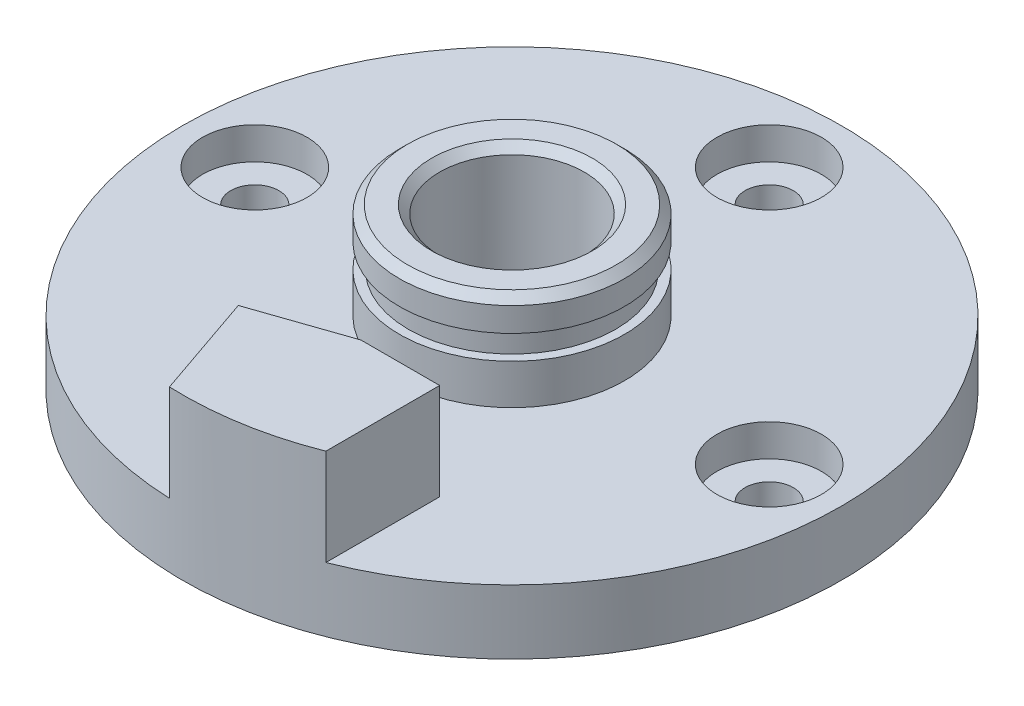
ISO-10303-21;
HEADER;
FILE_DESCRIPTION(('STEP AP214'),'2;1');
FILE_NAME('part.step','',(''),(''),'','','');
FILE_SCHEMA(('AUTOMOTIVE_DESIGN { 1 0 10303 214 1 1 1 1 }'));
ENDSEC;
DATA;
#1=APPLICATION_CONTEXT('core data for automotive mechanical design processes');
#2=APPLICATION_PROTOCOL_DEFINITION('international standard','automotive_design',2000,#1);
#3=PRODUCT_CONTEXT('',#1,'mechanical');
#4=PRODUCT('Part','Part','',(#3));
#5=PRODUCT_RELATED_PRODUCT_CATEGORY('part','',(#4));
#6=PRODUCT_DEFINITION_FORMATION('','',#4);
#7=PRODUCT_DEFINITION_CONTEXT('part definition',#1,'design');
#8=PRODUCT_DEFINITION('design','',#6,#7);
#9=PRODUCT_DEFINITION_SHAPE('','',#8);
#10=(LENGTH_UNIT() NAMED_UNIT(*) SI_UNIT(.MILLI.,.METRE.));
#11=(NAMED_UNIT(*) PLANE_ANGLE_UNIT() SI_UNIT($,.RADIAN.));
#12=(NAMED_UNIT(*) SI_UNIT($,.STERADIAN.) SOLID_ANGLE_UNIT());
#13=UNCERTAINTY_MEASURE_WITH_UNIT(LENGTH_MEASURE(1.E-05),#10,'distance_accuracy_value','');
#14=(GEOMETRIC_REPRESENTATION_CONTEXT(3) GLOBAL_UNCERTAINTY_ASSIGNED_CONTEXT((#13)) GLOBAL_UNIT_ASSIGNED_CONTEXT((#10,
#11,#12)) REPRESENTATION_CONTEXT('',''));
#15=CARTESIAN_POINT('',(0.,0.,0.));
#16=DIRECTION('',(0.,0.,1.));
#17=DIRECTION('',(1.,0.,0.));
#18=AXIS2_PLACEMENT_3D('',#15,#16,#17);
#19=CARTESIAN_POINT('',(-20.5,4.,0.));
#20=DIRECTION('',(0.,1.,0.));
#21=DIRECTION('',(-1.,0.,0.));
#22=AXIS2_PLACEMENT_3D('',#19,#20,#21);
#23=PLANE('',#22);
#24=CARTESIAN_POINT('',(-16.,4.,0.));
#25=DIRECTION('',(0.,1.,0.));
#26=DIRECTION('',(-1.,0.,0.));
#27=AXIS2_PLACEMENT_3D('',#24,#25,#26);
#28=CIRCLE('',#27,3.25);
#29=CARTESIAN_POINT('',(-19.25,4.,0.));
#30=VERTEX_POINT('',#29);
#31=EDGE_CURVE('E136',#30,#30,#28,.T.);
#32=ORIENTED_EDGE('',*,*,#31,.F.);
#33=EDGE_LOOP('',(#32));
#34=FACE_BOUND('',#33,.T.);
#35=CARTESIAN_POINT('',(0.,4.,-16.));
#36=DIRECTION('',(0.,1.,0.));
#37=DIRECTION('',(-1.,0.,0.));
#38=AXIS2_PLACEMENT_3D('',#35,#36,#37);
#39=CIRCLE('',#38,3.25);
#40=CARTESIAN_POINT('',(-3.25,4.,-16.));
#41=VERTEX_POINT('',#40);
#42=EDGE_CURVE('E142',#41,#41,#39,.T.);
#43=ORIENTED_EDGE('',*,*,#42,.F.);
#44=EDGE_LOOP('',(#43));
#45=FACE_BOUND('',#44,.T.);
#46=CARTESIAN_POINT('',(16.,3.99999999999999,0.));
#47=DIRECTION('',(0.,1.,0.));
#48=DIRECTION('',(-1.,0.,0.));
#49=AXIS2_PLACEMENT_3D('',#46,#47,#48);
#50=CIRCLE('',#49,3.25);
#51=CARTESIAN_POINT('',(12.75,3.99999999999999,0.));
#52=VERTEX_POINT('',#51);
#53=EDGE_CURVE('E131',#52,#52,#50,.T.);
#54=ORIENTED_EDGE('',*,*,#53,.F.);
#55=EDGE_LOOP('',(#54));
#56=FACE_BOUND('',#55,.T.);
#57=CARTESIAN_POINT('',(0.,4.,0.));
#58=DIRECTION('',(0.,1.,0.));
#59=DIRECTION('',(-1.,0.,0.));
#60=AXIS2_PLACEMENT_3D('',#57,#58,#59);
#61=CIRCLE('',#60,7.);
#62=CARTESIAN_POINT('',(-7.,4.,0.));
#63=VERTEX_POINT('',#62);
#64=EDGE_CURVE('E172',#63,#63,#61,.T.);
#65=ORIENTED_EDGE('',*,*,#64,.F.);
#66=EDGE_LOOP('',(#65));
#67=FACE_BOUND('',#66,.T.);
#68=DIRECTION('',(0.325568154457158,0.,0.945518575599316));
#69=VECTOR('',#68,1.);
#70=CARTESIAN_POINT('',(-3.07311145359589,4.,13.9534089267429));
#71=LINE('',#70,#69);
#72=CARTESIAN_POINT('',(-3.07311145359589,4.,13.9534089267429));
#73=VERTEX_POINT('',#72);
#74=CARTESIAN_POINT('',(-0.82465292644425,4.,20.4834066392997));
#75=VERTEX_POINT('',#74);
#76=EDGE_CURVE('E102',#73,#75,#71,.T.);
#77=ORIENTED_EDGE('',*,*,#76,.F.);
#78=DIRECTION('',(-0.945518575599317,0.,0.325568154457158));
#79=VECTOR('',#78,1.);
#80=CARTESIAN_POINT('',(2.6,4.,12.));
#81=LINE('',#80,#79);
#82=CARTESIAN_POINT('',(2.6,4.,12.));
#83=VERTEX_POINT('',#82);
#84=EDGE_CURVE('E105',#83,#73,#81,.T.);
#85=ORIENTED_EDGE('',*,*,#84,.F.);
#86=DIRECTION('',(-1.,0.,0.));
#87=VECTOR('',#86,1.);
#88=CARTESIAN_POINT('',(7.5,4.,12.));
#89=LINE('',#88,#87);
#90=CARTESIAN_POINT('',(7.5,4.,12.));
#91=VERTEX_POINT('',#90);
#92=EDGE_CURVE('E49',#91,#83,#89,.T.);
#93=ORIENTED_EDGE('',*,*,#92,.F.);
#94=DIRECTION('',(0.,0.,-1.));
#95=VECTOR('',#94,1.);
#96=CARTESIAN_POINT('',(7.5,4.,12.));
#97=LINE('',#96,#95);
#98=CARTESIAN_POINT('',(7.49999999999999,4.,19.0787840283389));
#99=VERTEX_POINT('',#98);
#100=EDGE_CURVE('E116',#99,#91,#97,.T.);
#101=ORIENTED_EDGE('',*,*,#100,.F.);
#102=CARTESIAN_POINT('',(0.,4.,0.));
#103=DIRECTION('',(0.,1.,0.));
#104=DIRECTION('',(-1.,0.,0.));
#105=AXIS2_PLACEMENT_3D('',#102,#103,#104);
#106=CIRCLE('',#105,20.5);
#107=EDGE_CURVE('E69',#99,#75,#106,.T.);
#108=ORIENTED_EDGE('',*,*,#107,.T.);
#109=EDGE_LOOP('',(#77,#85,#93,#101,#108));
#110=FACE_BOUND('',#109,.T.);
#111=ADVANCED_FACE('F34',(#34,#45,#56,#67,#110),#23,.T.);
#112=CARTESIAN_POINT('',(0.,7.,0.));
#113=DIRECTION('',(0.,1.,0.));
#114=DIRECTION('',(-1.,0.,0.));
#115=AXIS2_PLACEMENT_3D('',#112,#113,#114);
#116=CYLINDRICAL_SURFACE('',#115,20.5);
#117=CARTESIAN_POINT('',(0.,0.,0.));
#118=DIRECTION('',(0.,1.,0.));
#119=DIRECTION('',(-1.,0.,0.));
#120=AXIS2_PLACEMENT_3D('',#117,#118,#119);
#121=CIRCLE('',#120,20.5);
#122=CARTESIAN_POINT('',(-20.5,0.,0.));
#123=VERTEX_POINT('',#122);
#124=EDGE_CURVE('E176',#123,#123,#121,.T.);
#125=ORIENTED_EDGE('',*,*,#124,.T.);
#126=EDGE_LOOP('',(#125));
#127=FACE_BOUND('',#126,.T.);
#128=CARTESIAN_POINT('',(0.,10.,0.));
#129=DIRECTION('',(0.,1.,0.));
#130=DIRECTION('',(1.,0.,0.));
#131=AXIS2_PLACEMENT_3D('',#128,#129,#130);
#132=CIRCLE('',#131,20.5);
#133=CARTESIAN_POINT('',(-0.824652926444249,10.,20.4834066392997));
#134=VERTEX_POINT('',#133);
#135=CARTESIAN_POINT('',(7.49999999999999,9.99999999999999,19.0787840283389));
#136=VERTEX_POINT('',#135);
#137=EDGE_CURVE('E58',#134,#136,#132,.T.);
#138=ORIENTED_EDGE('',*,*,#137,.F.);
#139=DIRECTION('',(0.,-1.,0.));
#140=VECTOR('',#139,1.);
#141=CARTESIAN_POINT('',(-0.824652926444249,10.,20.4834066392997));
#142=LINE('',#141,#140);
#143=EDGE_CURVE('E97',#134,#75,#142,.T.);
#144=ORIENTED_EDGE('',*,*,#143,.T.);
#145=ORIENTED_EDGE('',*,*,#107,.F.);
#146=DIRECTION('',(0.,-1.,0.));
#147=VECTOR('',#146,1.);
#148=CARTESIAN_POINT('',(7.49999999999999,9.99999999999999,19.0787840283389));
#149=LINE('',#148,#147);
#150=EDGE_CURVE('E123',#136,#99,#149,.T.);
#151=ORIENTED_EDGE('',*,*,#150,.F.);
#152=EDGE_LOOP('',(#138,#144,#145,#151));
#153=FACE_BOUND('',#152,.T.);
#154=ADVANCED_FACE('F215',(#127,#153),#116,.T.);
#155=CARTESIAN_POINT('',(7.5,9.99999999999999,12.));
#156=DIRECTION('',(0.,0.,1.));
#157=DIRECTION('',(1.,0.,0.));
#158=AXIS2_PLACEMENT_3D('',#155,#156,#157);
#159=PLANE('',#158);
#160=DIRECTION('',(0.,1.,0.));
#161=VECTOR('',#160,1.);
#162=CARTESIAN_POINT('',(2.6,4.,12.));
#163=LINE('',#162,#161);
#164=CARTESIAN_POINT('',(2.60000000000001,10.,12.));
#165=VERTEX_POINT('',#164);
#166=EDGE_CURVE('E90',#83,#165,#163,.T.);
#167=ORIENTED_EDGE('',*,*,#166,.T.);
#168=DIRECTION('',(-1.,0.,0.));
#169=VECTOR('',#168,1.);
#170=CARTESIAN_POINT('',(7.5,9.99999999999999,12.));
#171=LINE('',#170,#169);
#172=CARTESIAN_POINT('',(7.5,9.99999999999999,12.));
#173=VERTEX_POINT('',#172);
#174=EDGE_CURVE('E101',#173,#165,#171,.T.);
#175=ORIENTED_EDGE('',*,*,#174,.F.);
#176=DIRECTION('',(0.,-1.,0.));
#177=VECTOR('',#176,1.);
#178=CARTESIAN_POINT('',(7.5,9.99999999999999,12.));
#179=LINE('',#178,#177);
#180=EDGE_CURVE('E129',#173,#91,#179,.T.);
#181=ORIENTED_EDGE('',*,*,#180,.T.);
#182=ORIENTED_EDGE('',*,*,#92,.T.);
#183=EDGE_LOOP('',(#167,#175,#181,#182));
#184=FACE_BOUND('',#183,.T.);
#185=ADVANCED_FACE('F221',(#184),#159,.F.);
#186=CARTESIAN_POINT('',(0.,10.,0.));
#187=DIRECTION('',(0.,-1.,0.));
#188=DIRECTION('',(1.,0.,0.));
#189=AXIS2_PLACEMENT_3D('',#186,#187,#188);
#190=PLANE('',#189);
#191=ORIENTED_EDGE('',*,*,#174,.T.);
#192=DIRECTION('',(-0.945518575599317,0.,0.325568154457158));
#193=VECTOR('',#192,1.);
#194=CARTESIAN_POINT('',(2.60000000000001,10.,12.));
#195=LINE('',#194,#193);
#196=CARTESIAN_POINT('',(-3.07311145359589,10.,13.9534089267429));
#197=VERTEX_POINT('',#196);
#198=EDGE_CURVE('E77',#165,#197,#195,.T.);
#199=ORIENTED_EDGE('',*,*,#198,.T.);
#200=DIRECTION('',(0.325568154457158,0.,0.945518575599316));
#201=VECTOR('',#200,1.);
#202=CARTESIAN_POINT('',(-3.07311145359589,10.,13.9534089267429));
#203=LINE('',#202,#201);
#204=EDGE_CURVE('E94',#197,#134,#203,.T.);
#205=ORIENTED_EDGE('',*,*,#204,.T.);
#206=ORIENTED_EDGE('',*,*,#137,.T.);
#207=DIRECTION('',(0.,0.,-1.));
#208=VECTOR('',#207,1.);
#209=CARTESIAN_POINT('',(7.5,9.99999999999999,12.));
#210=LINE('',#209,#208);
#211=EDGE_CURVE('E119',#136,#173,#210,.T.);
#212=ORIENTED_EDGE('',*,*,#211,.T.);
#213=EDGE_LOOP('',(#191,#199,#205,#206,#212));
#214=FACE_BOUND('',#213,.T.);
#215=ADVANCED_FACE('F100',(#214),#190,.F.);
#216=CARTESIAN_POINT('',(0.,7.,0.));
#217=DIRECTION('',(0.,1.,0.));
#218=DIRECTION('',(-1.,0.,0.));
#219=AXIS2_PLACEMENT_3D('',#216,#217,#218);
#220=CYLINDRICAL_SURFACE('',#219,4.5);
#221=CARTESIAN_POINT('',(0.,9.49999999999999,0.));
#222=DIRECTION('',(0.,1.,0.));
#223=DIRECTION('',(-1.,0.,0.));
#224=AXIS2_PLACEMENT_3D('',#221,#222,#223);
#225=CIRCLE('',#224,4.5);
#226=CARTESIAN_POINT('',(-4.5,9.49999999999999,0.));
#227=VERTEX_POINT('',#226);
#228=EDGE_CURVE('E189',#227,#227,#225,.T.);
#229=ORIENTED_EDGE('',*,*,#228,.T.);
#230=EDGE_LOOP('',(#229));
#231=FACE_BOUND('',#230,.T.);
#232=CARTESIAN_POINT('',(0.,1.50000000000001,0.));
#233=DIRECTION('',(0.,-1.,0.));
#234=DIRECTION('',(1.,0.,0.));
#235=AXIS2_PLACEMENT_3D('',#232,#233,#234);
#236=CIRCLE('',#235,4.5);
#237=CARTESIAN_POINT('',(4.5,1.50000000000001,0.));
#238=VERTEX_POINT('',#237);
#239=EDGE_CURVE('E179',#238,#238,#236,.T.);
#240=ORIENTED_EDGE('',*,*,#239,.T.);
#241=EDGE_LOOP('',(#240));
#242=FACE_BOUND('',#241,.T.);
#243=ADVANCED_FACE('F235',(#231,#242),#220,.F.);
#244=CARTESIAN_POINT('',(16.,10.,0.));
#245=DIRECTION('',(0.,-1.,0.));
#246=DIRECTION('',(0.,0.,-1.));
#247=AXIS2_PLACEMENT_3D('',#244,#245,#246);
#248=CYLINDRICAL_SURFACE('',#247,1.5);
#249=CARTESIAN_POINT('',(16.,0.,0.));
#250=DIRECTION('',(0.,1.,0.));
#251=DIRECTION('',(0.,0.,1.));
#252=AXIS2_PLACEMENT_3D('',#249,#250,#251);
#253=CIRCLE('',#252,1.5);
#254=CARTESIAN_POINT('',(16.,0.,1.5));
#255=VERTEX_POINT('',#254);
#256=EDGE_CURVE('E157',#255,#255,#253,.T.);
#257=ORIENTED_EDGE('',*,*,#256,.F.);
#258=EDGE_LOOP('',(#257));
#259=FACE_BOUND('',#258,.T.);
#260=CARTESIAN_POINT('',(16.,1.99999999999999,0.));
#261=DIRECTION('',(0.,1.,0.));
#262=DIRECTION('',(-1.,0.,0.));
#263=AXIS2_PLACEMENT_3D('',#260,#261,#262);
#264=CIRCLE('',#263,1.5);
#265=CARTESIAN_POINT('',(14.5,1.99999999999999,0.));
#266=VERTEX_POINT('',#265);
#267=EDGE_CURVE('E160',#266,#266,#264,.T.);
#268=ORIENTED_EDGE('',*,*,#267,.T.);
#269=EDGE_LOOP('',(#268));
#270=FACE_BOUND('',#269,.T.);
#271=ADVANCED_FACE('F238',(#259,#270),#248,.F.);
#272=CARTESIAN_POINT('',(0.,10.,-16.));
#273=DIRECTION('',(0.,-1.,0.));
#274=DIRECTION('',(0.,0.,-1.));
#275=AXIS2_PLACEMENT_3D('',#272,#273,#274);
#276=CYLINDRICAL_SURFACE('',#275,1.5);
#277=CARTESIAN_POINT('',(0.,0.,-16.));
#278=DIRECTION('',(0.,1.,0.));
#279=DIRECTION('',(0.,0.,1.));
#280=AXIS2_PLACEMENT_3D('',#277,#278,#279);
#281=CIRCLE('',#280,1.5);
#282=CARTESIAN_POINT('',(0.,0.,-14.5));
#283=VERTEX_POINT('',#282);
#284=EDGE_CURVE('E154',#283,#283,#281,.T.);
#285=ORIENTED_EDGE('',*,*,#284,.F.);
#286=EDGE_LOOP('',(#285));
#287=FACE_BOUND('',#286,.T.);
#288=CARTESIAN_POINT('',(0.,2.,-16.));
#289=DIRECTION('',(0.,1.,0.));
#290=DIRECTION('',(-1.,0.,0.));
#291=AXIS2_PLACEMENT_3D('',#288,#289,#290);
#292=CIRCLE('',#291,1.5);
#293=CARTESIAN_POINT('',(-1.5,2.,-16.));
#294=VERTEX_POINT('',#293);
#295=EDGE_CURVE('E182',#294,#294,#292,.T.);
#296=ORIENTED_EDGE('',*,*,#295,.T.);
#297=EDGE_LOOP('',(#296));
#298=FACE_BOUND('',#297,.T.);
#299=ADVANCED_FACE('F334',(#287,#298),#276,.F.);
#300=CARTESIAN_POINT('',(-16.,10.,0.));
#301=DIRECTION('',(0.,-1.,0.));
#302=DIRECTION('',(0.,0.,-1.));
#303=AXIS2_PLACEMENT_3D('',#300,#301,#302);
#304=CYLINDRICAL_SURFACE('',#303,1.5);
#305=CARTESIAN_POINT('',(-16.,0.,0.));
#306=DIRECTION('',(0.,1.,0.));
#307=DIRECTION('',(0.,0.,1.));
#308=AXIS2_PLACEMENT_3D('',#305,#306,#307);
#309=CIRCLE('',#308,1.5);
#310=CARTESIAN_POINT('',(-16.,0.,1.5));
#311=VERTEX_POINT('',#310);
#312=EDGE_CURVE('E150',#311,#311,#309,.T.);
#313=ORIENTED_EDGE('',*,*,#312,.F.);
#314=EDGE_LOOP('',(#313));
#315=FACE_BOUND('',#314,.T.);
#316=CARTESIAN_POINT('',(-16.,2.,0.));
#317=DIRECTION('',(0.,1.,0.));
#318=DIRECTION('',(-1.,0.,0.));
#319=AXIS2_PLACEMENT_3D('',#316,#317,#318);
#320=CIRCLE('',#319,1.5);
#321=CARTESIAN_POINT('',(-17.5,2.,0.));
#322=VERTEX_POINT('',#321);
#323=EDGE_CURVE('E135',#322,#322,#320,.T.);
#324=ORIENTED_EDGE('',*,*,#323,.T.);
#325=EDGE_LOOP('',(#324));
#326=FACE_BOUND('',#325,.T.);
#327=ADVANCED_FACE('F233',(#315,#326),#304,.F.);
#328=CARTESIAN_POINT('',(-4.5,0.,0.));
#329=DIRECTION('',(0.,-1.,0.));
#330=DIRECTION('',(1.,0.,0.));
#331=AXIS2_PLACEMENT_3D('',#328,#329,#330);
#332=PLANE('',#331);
#333=CARTESIAN_POINT('',(0.,0.,0.));
#334=DIRECTION('',(0.,-1.,0.));
#335=DIRECTION('',(1.,0.,0.));
#336=AXIS2_PLACEMENT_3D('',#333,#334,#335);
#337=CIRCLE('',#336,7.5);
#338=CARTESIAN_POINT('',(7.5,0.,0.));
#339=VERTEX_POINT('',#338);
#340=EDGE_CURVE('E108',#339,#339,#337,.T.);
#341=ORIENTED_EDGE('',*,*,#340,.F.);
#342=EDGE_LOOP('',(#341));
#343=FACE_BOUND('',#342,.T.);
#344=ORIENTED_EDGE('',*,*,#312,.T.);
#345=EDGE_LOOP('',(#344));
#346=FACE_BOUND('',#345,.T.);
#347=ORIENTED_EDGE('',*,*,#284,.T.);
#348=EDGE_LOOP('',(#347));
#349=FACE_BOUND('',#348,.T.);
#350=ORIENTED_EDGE('',*,*,#256,.T.);
#351=EDGE_LOOP('',(#350));
#352=FACE_BOUND('',#351,.T.);
#353=ORIENTED_EDGE('',*,*,#124,.F.);
#354=EDGE_LOOP('',(#353));
#355=FACE_BOUND('',#354,.T.);
#356=ADVANCED_FACE('F230',(#343,#346,#349,#352,#355),#332,.T.);
#357=CARTESIAN_POINT('',(0.,7.,0.));
#358=DIRECTION('',(0.,1.,0.));
#359=DIRECTION('',(-1.,0.,0.));
#360=AXIS2_PLACEMENT_3D('',#357,#358,#359);
#361=CYLINDRICAL_SURFACE('',#360,7.);
#362=ORIENTED_EDGE('',*,*,#64,.T.);
#363=EDGE_LOOP('',(#362));
#364=FACE_BOUND('',#363,.T.);
#365=CARTESIAN_POINT('',(0.,6.5,0.));
#366=DIRECTION('',(0.,1.,0.));
#367=DIRECTION('',(-1.,0.,0.));
#368=AXIS2_PLACEMENT_3D('',#365,#366,#367);
#369=CIRCLE('',#368,7.);
#370=CARTESIAN_POINT('',(-7.,6.5,0.));
#371=VERTEX_POINT('',#370);
#372=EDGE_CURVE('E169',#371,#371,#369,.T.);
#373=ORIENTED_EDGE('',*,*,#372,.F.);
#374=EDGE_LOOP('',(#373));
#375=FACE_BOUND('',#374,.T.);
#376=ADVANCED_FACE('F227',(#364,#375),#361,.T.);
#377=CARTESIAN_POINT('',(-7.,6.5,0.));
#378=DIRECTION('',(0.,1.,0.));
#379=DIRECTION('',(-1.,0.,0.));
#380=AXIS2_PLACEMENT_3D('',#377,#378,#379);
#381=PLANE('',#380);
#382=ORIENTED_EDGE('',*,*,#372,.T.);
#383=EDGE_LOOP('',(#382));
#384=FACE_BOUND('',#383,.T.);
#385=CARTESIAN_POINT('',(0.,6.5,0.));
#386=DIRECTION('',(0.,1.,0.));
#387=DIRECTION('',(-1.,0.,0.));
#388=AXIS2_PLACEMENT_3D('',#385,#386,#387);
#389=CIRCLE('',#388,6.45);
#390=CARTESIAN_POINT('',(-6.45,6.5,0.));
#391=VERTEX_POINT('',#390);
#392=EDGE_CURVE('E166',#391,#391,#389,.T.);
#393=ORIENTED_EDGE('',*,*,#392,.F.);
#394=EDGE_LOOP('',(#393));
#395=FACE_BOUND('',#394,.T.);
#396=ADVANCED_FACE('F277',(#384,#395),#381,.T.);
#397=CARTESIAN_POINT('',(0.,7.,0.));
#398=DIRECTION('',(0.,1.,0.));
#399=DIRECTION('',(-1.,0.,0.));
#400=AXIS2_PLACEMENT_3D('',#397,#398,#399);
#401=CYLINDRICAL_SURFACE('',#400,6.45);
#402=ORIENTED_EDGE('',*,*,#392,.T.);
#403=EDGE_LOOP('',(#402));
#404=FACE_BOUND('',#403,.T.);
#405=CARTESIAN_POINT('',(0.,8.,0.));
#406=DIRECTION('',(0.,1.,0.));
#407=DIRECTION('',(-1.,0.,0.));
#408=AXIS2_PLACEMENT_3D('',#405,#406,#407);
#409=CIRCLE('',#408,6.45);
#410=CARTESIAN_POINT('',(-6.45,8.,0.));
#411=VERTEX_POINT('',#410);
#412=EDGE_CURVE('E163',#411,#411,#409,.T.);
#413=ORIENTED_EDGE('',*,*,#412,.F.);
#414=EDGE_LOOP('',(#413));
#415=FACE_BOUND('',#414,.T.);
#416=ADVANCED_FACE('F274',(#404,#415),#401,.T.);
#417=CARTESIAN_POINT('',(-6.45,8.,0.));
#418=DIRECTION('',(0.,-1.,0.));
#419=DIRECTION('',(1.,0.,0.));
#420=AXIS2_PLACEMENT_3D('',#417,#418,#419);
#421=PLANE('',#420);
#422=ORIENTED_EDGE('',*,*,#412,.T.);
#423=EDGE_LOOP('',(#422));
#424=FACE_BOUND('',#423,.T.);
#425=CARTESIAN_POINT('',(0.,8.,0.));
#426=DIRECTION('',(0.,1.,0.));
#427=DIRECTION('',(-1.,0.,0.));
#428=AXIS2_PLACEMENT_3D('',#425,#426,#427);
#429=CIRCLE('',#428,7.);
#430=CARTESIAN_POINT('',(-7.,8.,0.));
#431=VERTEX_POINT('',#430);
#432=EDGE_CURVE('E153',#431,#431,#429,.T.);
#433=ORIENTED_EDGE('',*,*,#432,.F.);
#434=EDGE_LOOP('',(#433));
#435=FACE_BOUND('',#434,.T.);
#436=ADVANCED_FACE('F266',(#424,#435),#421,.T.);
#437=CARTESIAN_POINT('',(0.,7.,0.));
#438=DIRECTION('',(0.,1.,0.));
#439=DIRECTION('',(-1.,0.,0.));
#440=AXIS2_PLACEMENT_3D('',#437,#438,#439);
#441=CYLINDRICAL_SURFACE('',#440,7.);
#442=CARTESIAN_POINT('',(0.,9.5,0.));
#443=DIRECTION('',(0.,1.,0.));
#444=DIRECTION('',(-1.,0.,0.));
#445=AXIS2_PLACEMENT_3D('',#442,#443,#444);
#446=CIRCLE('',#445,7.);
#447=CARTESIAN_POINT('',(-7.,9.5,0.));
#448=VERTEX_POINT('',#447);
#449=EDGE_CURVE('E11',#448,#448,#446,.F.);
#450=ORIENTED_EDGE('',*,*,#449,.T.);
#451=EDGE_LOOP('',(#450));
#452=FACE_BOUND('',#451,.T.);
#453=ORIENTED_EDGE('',*,*,#432,.T.);
#454=EDGE_LOOP('',(#453));
#455=FACE_BOUND('',#454,.T.);
#456=ADVANCED_FACE('F257',(#452,#455),#441,.T.);
#457=CARTESIAN_POINT('',(-7.,10.,0.));
#458=DIRECTION('',(0.,1.,0.));
#459=DIRECTION('',(-1.,0.,0.));
#460=AXIS2_PLACEMENT_3D('',#457,#458,#459);
#461=PLANE('',#460);
#462=CARTESIAN_POINT('',(0.,10.,0.));
#463=DIRECTION('',(0.,1.,0.));
#464=DIRECTION('',(-1.,0.,0.));
#465=AXIS2_PLACEMENT_3D('',#462,#463,#464);
#466=CIRCLE('',#465,6.50000000000001);
#467=CARTESIAN_POINT('',(-6.50000000000001,10.,0.));
#468=VERTEX_POINT('',#467);
#469=EDGE_CURVE('E42',#468,#468,#466,.T.);
#470=ORIENTED_EDGE('',*,*,#469,.T.);
#471=EDGE_LOOP('',(#470));
#472=FACE_BOUND('',#471,.T.);
#473=CARTESIAN_POINT('',(0.,10.,0.));
#474=DIRECTION('',(0.,1.,0.));
#475=DIRECTION('',(-1.,0.,0.));
#476=AXIS2_PLACEMENT_3D('',#473,#474,#475);
#477=CIRCLE('',#476,5.00000000000001);
#478=CARTESIAN_POINT('',(-5.00000000000001,10.,0.));
#479=VERTEX_POINT('',#478);
#480=EDGE_CURVE('E192',#479,#479,#477,.F.);
#481=ORIENTED_EDGE('',*,*,#480,.T.);
#482=EDGE_LOOP('',(#481));
#483=FACE_BOUND('',#482,.T.);
#484=ADVANCED_FACE('F200',(#472,#483),#461,.T.);
#485=CARTESIAN_POINT('',(-16.,2.,0.));
#486=DIRECTION('',(0.,1.,0.));
#487=DIRECTION('',(0.,0.,1.));
#488=AXIS2_PLACEMENT_3D('',#485,#486,#487);
#489=CYLINDRICAL_SURFACE('',#488,3.25);
#490=CARTESIAN_POINT('',(-16.,2.,0.));
#491=DIRECTION('',(0.,1.,0.));
#492=DIRECTION('',(-1.,0.,0.));
#493=AXIS2_PLACEMENT_3D('',#490,#491,#492);
#494=CIRCLE('',#493,3.25);
#495=CARTESIAN_POINT('',(-19.25,2.,0.));
#496=VERTEX_POINT('',#495);
#497=EDGE_CURVE('E132',#496,#496,#494,.T.);
#498=ORIENTED_EDGE('',*,*,#497,.F.);
#499=EDGE_LOOP('',(#498));
#500=FACE_BOUND('',#499,.T.);
#501=ORIENTED_EDGE('',*,*,#31,.T.);
#502=EDGE_LOOP('',(#501));
#503=FACE_BOUND('',#502,.T.);
#504=ADVANCED_FACE('F256',(#500,#503),#489,.F.);
#505=CARTESIAN_POINT('',(-16.,2.,0.));
#506=DIRECTION('',(0.,1.,0.));
#507=DIRECTION('',(-1.,0.,0.));
#508=AXIS2_PLACEMENT_3D('',#505,#506,#507);
#509=PLANE('',#508);
#510=ORIENTED_EDGE('',*,*,#323,.F.);
#511=EDGE_LOOP('',(#510));
#512=FACE_BOUND('',#511,.T.);
#513=ORIENTED_EDGE('',*,*,#497,.T.);
#514=EDGE_LOOP('',(#513));
#515=FACE_BOUND('',#514,.T.);
#516=ADVANCED_FACE('F263',(#512,#515),#509,.T.);
#517=CARTESIAN_POINT('',(0.,2.,-16.));
#518=DIRECTION('',(0.,1.,0.));
#519=DIRECTION('',(0.,0.,1.));
#520=AXIS2_PLACEMENT_3D('',#517,#518,#519);
#521=CYLINDRICAL_SURFACE('',#520,3.25);
#522=CARTESIAN_POINT('',(0.,2.,-16.));
#523=DIRECTION('',(0.,1.,0.));
#524=DIRECTION('',(-1.,0.,0.));
#525=AXIS2_PLACEMENT_3D('',#522,#523,#524);
#526=CIRCLE('',#525,3.25);
#527=CARTESIAN_POINT('',(-3.25,2.,-16.));
#528=VERTEX_POINT('',#527);
#529=EDGE_CURVE('E139',#528,#528,#526,.T.);
#530=ORIENTED_EDGE('',*,*,#529,.F.);
#531=EDGE_LOOP('',(#530));
#532=FACE_BOUND('',#531,.T.);
#533=ORIENTED_EDGE('',*,*,#42,.T.);
#534=EDGE_LOOP('',(#533));
#535=FACE_BOUND('',#534,.T.);
#536=ADVANCED_FACE('F316',(#532,#535),#521,.F.);
#537=CARTESIAN_POINT('',(0.,2.,-16.));
#538=DIRECTION('',(0.,1.,0.));
#539=DIRECTION('',(-1.,0.,0.));
#540=AXIS2_PLACEMENT_3D('',#537,#538,#539);
#541=PLANE('',#540);
#542=ORIENTED_EDGE('',*,*,#295,.F.);
#543=EDGE_LOOP('',(#542));
#544=FACE_BOUND('',#543,.T.);
#545=ORIENTED_EDGE('',*,*,#529,.T.);
#546=EDGE_LOOP('',(#545));
#547=FACE_BOUND('',#546,.T.);
#548=ADVANCED_FACE('F319',(#544,#547),#541,.T.);
#549=CARTESIAN_POINT('',(16.,1.99999999999999,0.));
#550=DIRECTION('',(0.,1.,0.));
#551=DIRECTION('',(0.,0.,1.));
#552=AXIS2_PLACEMENT_3D('',#549,#550,#551);
#553=CYLINDRICAL_SURFACE('',#552,3.25);
#554=CARTESIAN_POINT('',(16.,1.99999999999999,0.));
#555=DIRECTION('',(0.,1.,0.));
#556=DIRECTION('',(-1.,0.,0.));
#557=AXIS2_PLACEMENT_3D('',#554,#555,#556);
#558=CIRCLE('',#557,3.25);
#559=CARTESIAN_POINT('',(12.75,2.,0.));
#560=VERTEX_POINT('',#559);
#561=EDGE_CURVE('E145',#560,#560,#558,.T.);
#562=ORIENTED_EDGE('',*,*,#561,.F.);
#563=EDGE_LOOP('',(#562));
#564=FACE_BOUND('',#563,.T.);
#565=ORIENTED_EDGE('',*,*,#53,.T.);
#566=EDGE_LOOP('',(#565));
#567=FACE_BOUND('',#566,.T.);
#568=ADVANCED_FACE('F322',(#564,#567),#553,.F.);
#569=CARTESIAN_POINT('',(16.,1.99999999999999,0.));
#570=DIRECTION('',(0.,1.,0.));
#571=DIRECTION('',(-1.,0.,0.));
#572=AXIS2_PLACEMENT_3D('',#569,#570,#571);
#573=PLANE('',#572);
#574=ORIENTED_EDGE('',*,*,#267,.F.);
#575=EDGE_LOOP('',(#574));
#576=FACE_BOUND('',#575,.T.);
#577=ORIENTED_EDGE('',*,*,#561,.T.);
#578=EDGE_LOOP('',(#577));
#579=FACE_BOUND('',#578,.T.);
#580=ADVANCED_FACE('F314',(#576,#579),#573,.T.);
#581=CARTESIAN_POINT('',(7.5,9.99999999999999,12.));
#582=DIRECTION('',(-1.,0.,0.));
#583=DIRECTION('',(0.,0.,1.));
#584=AXIS2_PLACEMENT_3D('',#581,#582,#583);
#585=PLANE('',#584);
#586=ORIENTED_EDGE('',*,*,#100,.T.);
#587=ORIENTED_EDGE('',*,*,#180,.F.);
#588=ORIENTED_EDGE('',*,*,#211,.F.);
#589=ORIENTED_EDGE('',*,*,#150,.T.);
#590=EDGE_LOOP('',(#586,#587,#588,#589));
#591=FACE_BOUND('',#590,.T.);
#592=ADVANCED_FACE('F302',(#591),#585,.F.);
#593=CARTESIAN_POINT('',(0.,1.,0.));
#594=DIRECTION('',(0.,-1.,0.));
#595=DIRECTION('',(1.,0.,0.));
#596=AXIS2_PLACEMENT_3D('',#593,#594,#595);
#597=CYLINDRICAL_SURFACE('',#596,7.5);
#598=CARTESIAN_POINT('',(0.,1.,0.));
#599=DIRECTION('',(0.,-1.,0.));
#600=DIRECTION('',(1.,0.,0.));
#601=AXIS2_PLACEMENT_3D('',#598,#599,#600);
#602=CIRCLE('',#601,7.5);
#603=CARTESIAN_POINT('',(7.5,0.999999999999999,0.));
#604=VERTEX_POINT('',#603);
#605=EDGE_CURVE('E113',#604,#604,#602,.T.);
#606=ORIENTED_EDGE('',*,*,#605,.F.);
#607=EDGE_LOOP('',(#606));
#608=FACE_BOUND('',#607,.T.);
#609=ORIENTED_EDGE('',*,*,#340,.T.);
#610=EDGE_LOOP('',(#609));
#611=FACE_BOUND('',#610,.T.);
#612=ADVANCED_FACE('F246',(#608,#611),#597,.F.);
#613=CARTESIAN_POINT('',(0.,1.,0.));
#614=DIRECTION('',(0.,-1.,0.));
#615=DIRECTION('',(1.,0.,0.));
#616=AXIS2_PLACEMENT_3D('',#613,#614,#615);
#617=PLANE('',#616);
#618=CARTESIAN_POINT('',(0.,1.,0.));
#619=DIRECTION('',(0.,-1.,0.));
#620=DIRECTION('',(1.,0.,0.));
#621=AXIS2_PLACEMENT_3D('',#618,#619,#620);
#622=CIRCLE('',#621,5.00000000000002);
#623=CARTESIAN_POINT('',(5.00000000000002,0.999999999999999,0.));
#624=VERTEX_POINT('',#623);
#625=EDGE_CURVE('E195',#624,#624,#622,.F.);
#626=ORIENTED_EDGE('',*,*,#625,.T.);
#627=EDGE_LOOP('',(#626));
#628=FACE_BOUND('',#627,.T.);
#629=ORIENTED_EDGE('',*,*,#605,.T.);
#630=EDGE_LOOP('',(#629));
#631=FACE_BOUND('',#630,.T.);
#632=ADVANCED_FACE('F241',(#628,#631),#617,.T.);
#633=CARTESIAN_POINT('',(0.,9.49999999999999,0.));
#634=DIRECTION('',(0.,1.,0.));
#635=DIRECTION('',(-1.,0.,0.));
#636=AXIS2_PLACEMENT_3D('',#633,#634,#635);
#637=CONICAL_SURFACE('',#636,4.5,0.785398163397454);
#638=ORIENTED_EDGE('',*,*,#480,.F.);
#639=EDGE_LOOP('',(#638));
#640=FACE_BOUND('',#639,.T.);
#641=ORIENTED_EDGE('',*,*,#228,.F.);
#642=EDGE_LOOP('',(#641));
#643=FACE_BOUND('',#642,.T.);
#644=ADVANCED_FACE('F211',(#640,#643),#637,.F.);
#645=CARTESIAN_POINT('',(0.,1.50000000000001,0.));
#646=DIRECTION('',(0.,-1.,0.));
#647=DIRECTION('',(1.,0.,0.));
#648=AXIS2_PLACEMENT_3D('',#645,#646,#647);
#649=CONICAL_SURFACE('',#648,4.5,0.785398163397453);
#650=ORIENTED_EDGE('',*,*,#625,.F.);
#651=EDGE_LOOP('',(#650));
#652=FACE_BOUND('',#651,.T.);
#653=ORIENTED_EDGE('',*,*,#239,.F.);
#654=EDGE_LOOP('',(#653));
#655=FACE_BOUND('',#654,.T.);
#656=ADVANCED_FACE('F204',(#652,#655),#649,.F.);
#657=CARTESIAN_POINT('',(0.,10.,0.));
#658=DIRECTION('',(0.,-1.,0.));
#659=DIRECTION('',(1.,0.,0.));
#660=AXIS2_PLACEMENT_3D('',#657,#658,#659);
#661=CONICAL_SURFACE('',#660,6.50000000000001,0.785398163397446);
#662=ORIENTED_EDGE('',*,*,#449,.F.);
#663=EDGE_LOOP('',(#662));
#664=FACE_BOUND('',#663,.T.);
#665=ORIENTED_EDGE('',*,*,#469,.F.);
#666=EDGE_LOOP('',(#665));
#667=FACE_BOUND('',#666,.T.);
#668=ADVANCED_FACE('F36',(#664,#667),#661,.T.);
#669=CARTESIAN_POINT('',(2.60000000000001,10.,12.));
#670=DIRECTION('',(0.325568154457158,0.,0.945518575599316));
#671=DIRECTION('',(0.945518575599317,0.,-0.325568154457158));
#672=AXIS2_PLACEMENT_3D('',#669,#670,#671);
#673=PLANE('',#672);
#674=ORIENTED_EDGE('',*,*,#84,.T.);
#675=DIRECTION('',(0.,-1.,0.));
#676=VECTOR('',#675,1.);
#677=CARTESIAN_POINT('',(-3.07311145359589,10.,13.9534089267429));
#678=LINE('',#677,#676);
#679=EDGE_CURVE('E96',#197,#73,#678,.T.);
#680=ORIENTED_EDGE('',*,*,#679,.F.);
#681=ORIENTED_EDGE('',*,*,#198,.F.);
#682=ORIENTED_EDGE('',*,*,#166,.F.);
#683=EDGE_LOOP('',(#674,#680,#681,#682));
#684=FACE_BOUND('',#683,.T.);
#685=ADVANCED_FACE('F104',(#684),#673,.F.);
#686=CARTESIAN_POINT('',(-3.07311145359589,10.,13.9534089267429));
#687=DIRECTION('',(0.945518575599317,0.,-0.325568154457158));
#688=DIRECTION('',(-0.325568154457158,0.,-0.945518575599317));
#689=AXIS2_PLACEMENT_3D('',#686,#687,#688);
#690=PLANE('',#689);
#691=ORIENTED_EDGE('',*,*,#76,.T.);
#692=ORIENTED_EDGE('',*,*,#143,.F.);
#693=ORIENTED_EDGE('',*,*,#204,.F.);
#694=ORIENTED_EDGE('',*,*,#679,.T.);
#695=EDGE_LOOP('',(#691,#692,#693,#694));
#696=FACE_BOUND('',#695,.T.);
#697=ADVANCED_FACE('F95',(#696),#690,.F.);
#698=CLOSED_SHELL('',(#111,#154,#185,#215,#243,#271,#299,#327,#356,#376,#396,#416,#436,#456,
#484,#504,#516,#536,#548,#568,#580,#592,#612,#632,#644,#656,#668,#685,#697));
#699=MANIFOLD_SOLID_BREP('B2',#698);
#700=ADVANCED_BREP_SHAPE_REPRESENTATION('',(#18,#699),#14);
#701=SHAPE_DEFINITION_REPRESENTATION(#9,#700);
ENDSEC;
END-ISO-10303-21;
